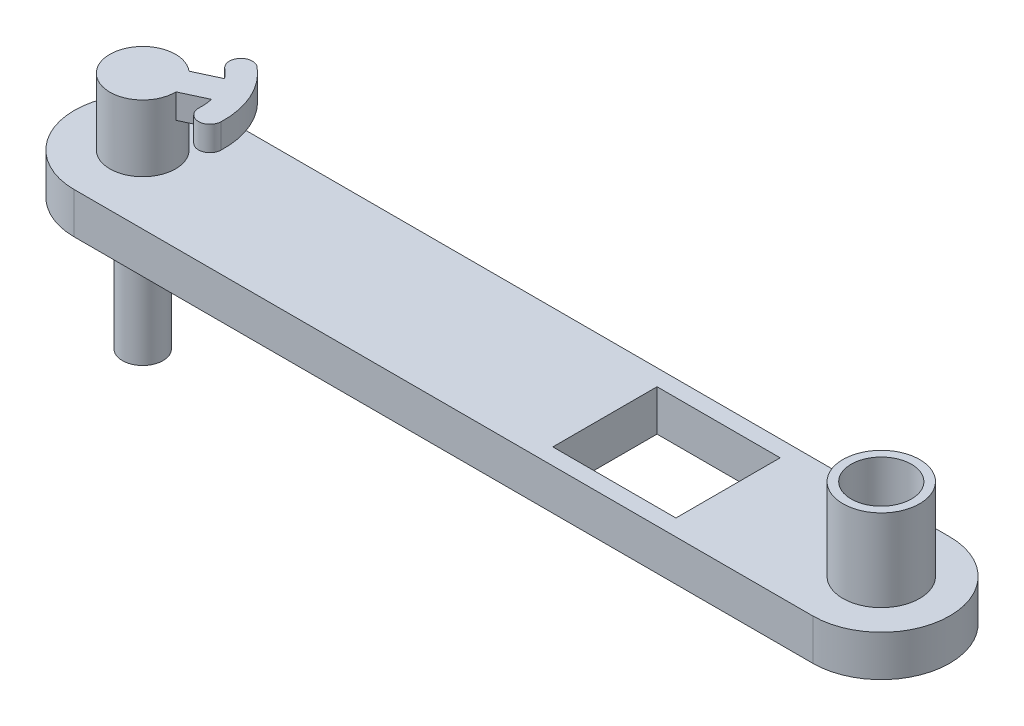
ISO-10303-21;
HEADER;
FILE_DESCRIPTION(('STEP AP214'),'2;1');
FILE_NAME('part.step','',(''),(''),'','','');
FILE_SCHEMA(('AUTOMOTIVE_DESIGN { 1 0 10303 214 1 1 1 1 }'));
ENDSEC;
DATA;
#1=APPLICATION_CONTEXT('core data for automotive mechanical design processes');
#2=APPLICATION_PROTOCOL_DEFINITION('international standard','automotive_design',2000,#1);
#3=PRODUCT_CONTEXT('',#1,'mechanical');
#4=PRODUCT('Part','Part','',(#3));
#5=PRODUCT_RELATED_PRODUCT_CATEGORY('part','',(#4));
#6=PRODUCT_DEFINITION_FORMATION('','',#4);
#7=PRODUCT_DEFINITION_CONTEXT('part definition',#1,'design');
#8=PRODUCT_DEFINITION('design','',#6,#7);
#9=PRODUCT_DEFINITION_SHAPE('','',#8);
#10=(LENGTH_UNIT() NAMED_UNIT(*) SI_UNIT(.MILLI.,.METRE.));
#11=(NAMED_UNIT(*) PLANE_ANGLE_UNIT() SI_UNIT($,.RADIAN.));
#12=(NAMED_UNIT(*) SI_UNIT($,.STERADIAN.) SOLID_ANGLE_UNIT());
#13=UNCERTAINTY_MEASURE_WITH_UNIT(LENGTH_MEASURE(1.E-05),#10,'distance_accuracy_value','');
#14=(GEOMETRIC_REPRESENTATION_CONTEXT(3) GLOBAL_UNCERTAINTY_ASSIGNED_CONTEXT((#13)) GLOBAL_UNIT_ASSIGNED_CONTEXT((#10,
#11,#12)) REPRESENTATION_CONTEXT('',''));
#15=CARTESIAN_POINT('',(0.,0.,0.));
#16=DIRECTION('',(0.,0.,1.));
#17=DIRECTION('',(1.,0.,0.));
#18=AXIS2_PLACEMENT_3D('',#15,#16,#17);
#19=CARTESIAN_POINT('',(0.,5.,0.));
#20=DIRECTION('',(0.,1.,0.));
#21=DIRECTION('',(0.,0.,1.));
#22=AXIS2_PLACEMENT_3D('',#19,#20,#21);
#23=PLANE('',#22);
#24=CARTESIAN_POINT('',(0.,5.,0.));
#25=DIRECTION('',(0.,1.,0.));
#26=DIRECTION('',(0.,0.,1.));
#27=AXIS2_PLACEMENT_3D('',#24,#25,#26);
#28=CIRCLE('',#27,8.35);
#29=CARTESIAN_POINT('',(0.,5.,-8.35));
#30=VERTEX_POINT('',#29);
#31=CARTESIAN_POINT('',(0.,5.,8.35));
#32=VERTEX_POINT('',#31);
#33=EDGE_CURVE('E280',#30,#32,#28,.T.);
#34=ORIENTED_EDGE('',*,*,#33,.T.);
#35=DIRECTION('',(1.,0.,0.));
#36=VECTOR('',#35,1.);
#37=CARTESIAN_POINT('',(0.,5.,8.35));
#38=LINE('',#37,#36);
#39=CARTESIAN_POINT('',(90.,5.,8.35));
#40=VERTEX_POINT('',#39);
#41=EDGE_CURVE('E283',#32,#40,#38,.T.);
#42=ORIENTED_EDGE('',*,*,#41,.T.);
#43=CARTESIAN_POINT('',(90.,5.,0.));
#44=DIRECTION('',(0.,1.,0.));
#45=DIRECTION('',(0.,0.,1.));
#46=AXIS2_PLACEMENT_3D('',#43,#44,#45);
#47=CIRCLE('',#46,8.35);
#48=CARTESIAN_POINT('',(90.,5.,-8.35));
#49=VERTEX_POINT('',#48);
#50=EDGE_CURVE('E287',#40,#49,#47,.T.);
#51=ORIENTED_EDGE('',*,*,#50,.T.);
#52=DIRECTION('',(-1.,0.,0.));
#53=VECTOR('',#52,1.);
#54=CARTESIAN_POINT('',(0.,5.,-8.35));
#55=LINE('',#54,#53);
#56=EDGE_CURVE('E289',#49,#30,#55,.T.);
#57=ORIENTED_EDGE('',*,*,#56,.T.);
#58=EDGE_LOOP('',(#34,#42,#51,#57));
#59=FACE_BOUND('',#58,.T.);
#60=CARTESIAN_POINT('',(0.,5.,0.));
#61=DIRECTION('',(0.,1.,0.));
#62=DIRECTION('',(0.,0.,1.));
#63=AXIS2_PLACEMENT_3D('',#60,#61,#62);
#64=CIRCLE('',#63,4.);
#65=CARTESIAN_POINT('',(0.,5.,4.));
#66=VERTEX_POINT('',#65);
#67=EDGE_CURVE('E270',#66,#66,#64,.T.);
#68=ORIENTED_EDGE('',*,*,#67,.F.);
#69=EDGE_LOOP('',(#68));
#70=FACE_BOUND('',#69,.T.);
#71=DIRECTION('',(0.,0.,-1.));
#72=VECTOR('',#71,1.);
#73=CARTESIAN_POINT('',(71.325,5.,0.));
#74=LINE('',#73,#72);
#75=CARTESIAN_POINT('',(71.325,5.,6.35));
#76=VERTEX_POINT('',#75);
#77=CARTESIAN_POINT('',(71.325,5.,-6.35));
#78=VERTEX_POINT('',#77);
#79=EDGE_CURVE('E171',#76,#78,#74,.T.);
#80=ORIENTED_EDGE('',*,*,#79,.F.);
#81=DIRECTION('',(1.,0.,0.));
#82=VECTOR('',#81,1.);
#83=CARTESIAN_POINT('',(0.,5.,6.34999999999999));
#84=LINE('',#83,#82);
#85=CARTESIAN_POINT('',(56.325,5.,6.35));
#86=VERTEX_POINT('',#85);
#87=EDGE_CURVE('E197',#86,#76,#84,.T.);
#88=ORIENTED_EDGE('',*,*,#87,.F.);
#89=DIRECTION('',(0.,0.,1.));
#90=VECTOR('',#89,1.);
#91=CARTESIAN_POINT('',(56.325,5.,0.));
#92=LINE('',#91,#90);
#93=CARTESIAN_POINT('',(56.325,5.,-6.35));
#94=VERTEX_POINT('',#93);
#95=EDGE_CURVE('E205',#94,#86,#92,.T.);
#96=ORIENTED_EDGE('',*,*,#95,.F.);
#97=DIRECTION('',(-1.,0.,0.));
#98=VECTOR('',#97,1.);
#99=CARTESIAN_POINT('',(0.,5.,-6.34999999999999));
#100=LINE('',#99,#98);
#101=EDGE_CURVE('E208',#78,#94,#100,.T.);
#102=ORIENTED_EDGE('',*,*,#101,.F.);
#103=EDGE_LOOP('',(#80,#88,#96,#102));
#104=FACE_BOUND('',#103,.T.);
#105=CARTESIAN_POINT('',(90.,5.,0.));
#106=DIRECTION('',(0.,1.,0.));
#107=DIRECTION('',(0.,0.,1.));
#108=AXIS2_PLACEMENT_3D('',#105,#106,#107);
#109=CIRCLE('',#108,4.675);
#110=CARTESIAN_POINT('',(90.,5.,4.675));
#111=VERTEX_POINT('',#110);
#112=EDGE_CURVE('E339',#111,#111,#109,.T.);
#113=ORIENTED_EDGE('',*,*,#112,.F.);
#114=EDGE_LOOP('',(#113));
#115=FACE_BOUND('',#114,.T.);
#116=ADVANCED_FACE('F47',(#59,#70,#104,#115),#23,.T.);
#117=CARTESIAN_POINT('',(0.,13.1,0.));
#118=DIRECTION('',(0.,-1.,0.));
#119=DIRECTION('',(0.,0.,-1.));
#120=AXIS2_PLACEMENT_3D('',#117,#118,#119);
#121=CYLINDRICAL_SURFACE('',#120,4.);
#122=ORIENTED_EDGE('',*,*,#67,.T.);
#123=EDGE_LOOP('',(#122));
#124=FACE_BOUND('',#123,.T.);
#125=DIRECTION('',(0.,-1.,0.));
#126=VECTOR('',#125,1.);
#127=CARTESIAN_POINT('',(2.60383776477137,13.1,-3.03645004812371));
#128=LINE('',#127,#126);
#129=CARTESIAN_POINT('',(2.60383776477137,13.1,-3.03645004812371));
#130=VERTEX_POINT('',#129);
#131=CARTESIAN_POINT('',(2.60383776477137,10.1,-3.03645004812371));
#132=VERTEX_POINT('',#131);
#133=EDGE_CURVE('E252',#130,#132,#128,.T.);
#134=ORIENTED_EDGE('',*,*,#133,.T.);
#135=CARTESIAN_POINT('',(0.,10.1,0.));
#136=DIRECTION('',(0.,-1.,0.));
#137=DIRECTION('',(0.,0.,1.));
#138=AXIS2_PLACEMENT_3D('',#135,#136,#137);
#139=CIRCLE('',#138,4.);
#140=CARTESIAN_POINT('',(3.99957991722122,10.1,-0.0579696969175384));
#141=VERTEX_POINT('',#140);
#142=EDGE_CURVE('E244',#132,#141,#139,.T.);
#143=ORIENTED_EDGE('',*,*,#142,.T.);
#144=DIRECTION('',(0.,-1.,0.));
#145=VECTOR('',#144,1.);
#146=CARTESIAN_POINT('',(3.99957991722122,13.1,-0.0579696969175384));
#147=LINE('',#146,#145);
#148=CARTESIAN_POINT('',(3.99957991722122,13.1,-0.0579696969175384));
#149=VERTEX_POINT('',#148);
#150=EDGE_CURVE('E250',#149,#141,#147,.T.);
#151=ORIENTED_EDGE('',*,*,#150,.F.);
#152=CARTESIAN_POINT('',(0.,13.1,0.));
#153=DIRECTION('',(0.,1.,0.));
#154=DIRECTION('',(0.,0.,1.));
#155=AXIS2_PLACEMENT_3D('',#152,#153,#154);
#156=CIRCLE('',#155,4.);
#157=EDGE_CURVE('E271',#130,#149,#156,.T.);
#158=ORIENTED_EDGE('',*,*,#157,.F.);
#159=EDGE_LOOP('',(#134,#143,#151,#158));
#160=FACE_BOUND('',#159,.T.);
#161=ADVANCED_FACE('F331',(#124,#160),#121,.T.);
#162=CARTESIAN_POINT('',(0.,5.,0.));
#163=DIRECTION('',(0.,-1.,0.));
#164=DIRECTION('',(0.,0.,-1.));
#165=AXIS2_PLACEMENT_3D('',#162,#163,#164);
#166=CYLINDRICAL_SURFACE('',#165,8.35);
#167=CARTESIAN_POINT('',(0.,0.,0.));
#168=DIRECTION('',(0.,1.,0.));
#169=DIRECTION('',(0.,0.,1.));
#170=AXIS2_PLACEMENT_3D('',#167,#168,#169);
#171=CIRCLE('',#170,8.35);
#172=CARTESIAN_POINT('',(0.,0.,-8.35));
#173=VERTEX_POINT('',#172);
#174=CARTESIAN_POINT('',(0.,0.,8.35));
#175=VERTEX_POINT('',#174);
#176=EDGE_CURVE('E279',#173,#175,#171,.T.);
#177=ORIENTED_EDGE('',*,*,#176,.T.);
#178=DIRECTION('',(0.,-1.,0.));
#179=VECTOR('',#178,1.);
#180=CARTESIAN_POINT('',(0.,5.,8.35));
#181=LINE('',#180,#179);
#182=EDGE_CURVE('E55',#32,#175,#181,.T.);
#183=ORIENTED_EDGE('',*,*,#182,.F.);
#184=ORIENTED_EDGE('',*,*,#33,.F.);
#185=DIRECTION('',(0.,-1.,0.));
#186=VECTOR('',#185,1.);
#187=CARTESIAN_POINT('',(0.,5.,-8.35));
#188=LINE('',#187,#186);
#189=EDGE_CURVE('E292',#30,#173,#188,.T.);
#190=ORIENTED_EDGE('',*,*,#189,.T.);
#191=EDGE_LOOP('',(#177,#183,#184,#190));
#192=FACE_BOUND('',#191,.T.);
#193=ADVANCED_FACE('F49',(#192),#166,.T.);
#194=CARTESIAN_POINT('',(0.,5.,8.35));
#195=DIRECTION('',(0.,0.,-1.));
#196=DIRECTION('',(-1.,0.,0.));
#197=AXIS2_PLACEMENT_3D('',#194,#195,#196);
#198=PLANE('',#197);
#199=DIRECTION('',(1.,0.,0.));
#200=VECTOR('',#199,1.);
#201=CARTESIAN_POINT('',(0.,0.,8.35));
#202=LINE('',#201,#200);
#203=CARTESIAN_POINT('',(90.,0.,8.35));
#204=VERTEX_POINT('',#203);
#205=EDGE_CURVE('E295',#175,#204,#202,.T.);
#206=ORIENTED_EDGE('',*,*,#205,.T.);
#207=DIRECTION('',(0.,-1.,0.));
#208=VECTOR('',#207,1.);
#209=CARTESIAN_POINT('',(90.,5.,8.35));
#210=LINE('',#209,#208);
#211=EDGE_CURVE('E307',#40,#204,#210,.T.);
#212=ORIENTED_EDGE('',*,*,#211,.F.);
#213=ORIENTED_EDGE('',*,*,#41,.F.);
#214=ORIENTED_EDGE('',*,*,#182,.T.);
#215=EDGE_LOOP('',(#206,#212,#213,#214));
#216=FACE_BOUND('',#215,.T.);
#217=ADVANCED_FACE('F312',(#216),#198,.F.);
#218=CARTESIAN_POINT('',(90.,5.,0.));
#219=DIRECTION('',(0.,-1.,0.));
#220=DIRECTION('',(0.,0.,-1.));
#221=AXIS2_PLACEMENT_3D('',#218,#219,#220);
#222=CYLINDRICAL_SURFACE('',#221,8.35);
#223=CARTESIAN_POINT('',(90.,0.,0.));
#224=DIRECTION('',(0.,1.,0.));
#225=DIRECTION('',(0.,0.,1.));
#226=AXIS2_PLACEMENT_3D('',#223,#224,#225);
#227=CIRCLE('',#226,8.35);
#228=CARTESIAN_POINT('',(90.,0.,-8.35));
#229=VERTEX_POINT('',#228);
#230=EDGE_CURVE('E298',#204,#229,#227,.T.);
#231=ORIENTED_EDGE('',*,*,#230,.T.);
#232=DIRECTION('',(0.,-1.,0.));
#233=VECTOR('',#232,1.);
#234=CARTESIAN_POINT('',(90.,5.,-8.35));
#235=LINE('',#234,#233);
#236=EDGE_CURVE('E304',#49,#229,#235,.T.);
#237=ORIENTED_EDGE('',*,*,#236,.F.);
#238=ORIENTED_EDGE('',*,*,#50,.F.);
#239=ORIENTED_EDGE('',*,*,#211,.T.);
#240=EDGE_LOOP('',(#231,#237,#238,#239));
#241=FACE_BOUND('',#240,.T.);
#242=ADVANCED_FACE('F323',(#241),#222,.T.);
#243=CARTESIAN_POINT('',(0.,5.,-8.35));
#244=DIRECTION('',(0.,0.,1.));
#245=DIRECTION('',(1.,0.,0.));
#246=AXIS2_PLACEMENT_3D('',#243,#244,#245);
#247=PLANE('',#246);
#248=DIRECTION('',(-1.,0.,0.));
#249=VECTOR('',#248,1.);
#250=CARTESIAN_POINT('',(0.,0.,-8.35));
#251=LINE('',#250,#249);
#252=EDGE_CURVE('E284',#229,#173,#251,.T.);
#253=ORIENTED_EDGE('',*,*,#252,.T.);
#254=ORIENTED_EDGE('',*,*,#189,.F.);
#255=ORIENTED_EDGE('',*,*,#56,.F.);
#256=ORIENTED_EDGE('',*,*,#236,.T.);
#257=EDGE_LOOP('',(#253,#254,#255,#256));
#258=FACE_BOUND('',#257,.T.);
#259=ADVANCED_FACE('F327',(#258),#247,.F.);
#260=CARTESIAN_POINT('',(0.,0.,0.));
#261=DIRECTION('',(0.,1.,0.));
#262=DIRECTION('',(0.,0.,1.));
#263=AXIS2_PLACEMENT_3D('',#260,#261,#262);
#264=PLANE('',#263);
#265=CARTESIAN_POINT('',(90.,0.,0.));
#266=DIRECTION('',(0.,-1.,0.));
#267=DIRECTION('',(0.,0.,-1.));
#268=AXIS2_PLACEMENT_3D('',#265,#266,#267);
#269=CIRCLE('',#268,3.675);
#270=CARTESIAN_POINT('',(90.,0.,-3.675));
#271=VERTEX_POINT('',#270);
#272=EDGE_CURVE('E194',#271,#271,#269,.T.);
#273=ORIENTED_EDGE('',*,*,#272,.F.);
#274=EDGE_LOOP('',(#273));
#275=FACE_BOUND('',#274,.T.);
#276=DIRECTION('',(-1.,0.,0.));
#277=VECTOR('',#276,1.);
#278=CARTESIAN_POINT('',(71.325,0.,6.35));
#279=LINE('',#278,#277);
#280=CARTESIAN_POINT('',(71.325,0.,6.35));
#281=VERTEX_POINT('',#280);
#282=CARTESIAN_POINT('',(56.325,0.,6.35));
#283=VERTEX_POINT('',#282);
#284=EDGE_CURVE('E192',#281,#283,#279,.T.);
#285=ORIENTED_EDGE('',*,*,#284,.F.);
#286=DIRECTION('',(0.,0.,1.));
#287=VECTOR('',#286,1.);
#288=CARTESIAN_POINT('',(71.325,0.,6.35));
#289=LINE('',#288,#287);
#290=CARTESIAN_POINT('',(71.325,0.,-6.35));
#291=VERTEX_POINT('',#290);
#292=EDGE_CURVE('E74',#291,#281,#289,.T.);
#293=ORIENTED_EDGE('',*,*,#292,.F.);
#294=DIRECTION('',(1.,0.,0.));
#295=VECTOR('',#294,1.);
#296=CARTESIAN_POINT('',(71.325,0.,-6.35));
#297=LINE('',#296,#295);
#298=CARTESIAN_POINT('',(56.325,0.,-6.35));
#299=VERTEX_POINT('',#298);
#300=EDGE_CURVE('E179',#299,#291,#297,.T.);
#301=ORIENTED_EDGE('',*,*,#300,.F.);
#302=DIRECTION('',(0.,0.,-1.));
#303=VECTOR('',#302,1.);
#304=CARTESIAN_POINT('',(56.325,0.,6.35));
#305=LINE('',#304,#303);
#306=EDGE_CURVE('E186',#283,#299,#305,.T.);
#307=ORIENTED_EDGE('',*,*,#306,.F.);
#308=EDGE_LOOP('',(#285,#293,#301,#307));
#309=FACE_BOUND('',#308,.T.);
#310=CARTESIAN_POINT('',(0.,0.,0.));
#311=DIRECTION('',(0.,1.,0.));
#312=DIRECTION('',(0.,0.,1.));
#313=AXIS2_PLACEMENT_3D('',#310,#311,#312);
#314=CIRCLE('',#313,2.475);
#315=CARTESIAN_POINT('',(0.,0.,2.475));
#316=VERTEX_POINT('',#315);
#317=EDGE_CURVE('E11',#316,#316,#314,.F.);
#318=ORIENTED_EDGE('',*,*,#317,.F.);
#319=EDGE_LOOP('',(#318));
#320=FACE_BOUND('',#319,.T.);
#321=ORIENTED_EDGE('',*,*,#176,.F.);
#322=ORIENTED_EDGE('',*,*,#252,.F.);
#323=ORIENTED_EDGE('',*,*,#230,.F.);
#324=ORIENTED_EDGE('',*,*,#205,.F.);
#325=EDGE_LOOP('',(#321,#322,#323,#324));
#326=FACE_BOUND('',#325,.T.);
#327=ADVANCED_FACE('F190',(#275,#309,#320,#326),#264,.F.);
#328=CARTESIAN_POINT('',(0.,-16.,0.));
#329=DIRECTION('',(0.,1.,0.));
#330=DIRECTION('',(0.,0.,1.));
#331=AXIS2_PLACEMENT_3D('',#328,#329,#330);
#332=CYLINDRICAL_SURFACE('',#331,2.475);
#333=CARTESIAN_POINT('',(0.,-16.,0.));
#334=DIRECTION('',(0.,-1.,0.));
#335=DIRECTION('',(0.,0.,-1.));
#336=AXIS2_PLACEMENT_3D('',#333,#334,#335);
#337=CIRCLE('',#336,2.475);
#338=CARTESIAN_POINT('',(0.,-16.,-2.475));
#339=VERTEX_POINT('',#338);
#340=EDGE_CURVE('E274',#339,#339,#337,.T.);
#341=ORIENTED_EDGE('',*,*,#340,.F.);
#342=EDGE_LOOP('',(#341));
#343=FACE_BOUND('',#342,.T.);
#344=ORIENTED_EDGE('',*,*,#317,.T.);
#345=EDGE_LOOP('',(#344));
#346=FACE_BOUND('',#345,.T.);
#347=ADVANCED_FACE('F415',(#343,#346),#332,.T.);
#348=CARTESIAN_POINT('',(0.,-16.,0.));
#349=DIRECTION('',(0.,-1.,0.));
#350=DIRECTION('',(0.,0.,-1.));
#351=AXIS2_PLACEMENT_3D('',#348,#349,#350);
#352=PLANE('',#351);
#353=ORIENTED_EDGE('',*,*,#340,.T.);
#354=EDGE_LOOP('',(#353));
#355=FACE_BOUND('',#354,.T.);
#356=ADVANCED_FACE('F408',(#355),#352,.T.);
#357=CARTESIAN_POINT('',(0.,13.1,0.));
#358=DIRECTION('',(0.,1.,0.));
#359=DIRECTION('',(0.,0.,1.));
#360=AXIS2_PLACEMENT_3D('',#357,#358,#359);
#361=PLANE('',#360);
#362=ORIENTED_EDGE('',*,*,#157,.T.);
#363=DIRECTION('',(0.90630778703665,0.,-0.4226182617407));
#364=VECTOR('',#363,1.);
#365=CARTESIAN_POINT('',(3.99957991722122,13.1,-0.0579696969175384));
#366=LINE('',#365,#364);
#367=CARTESIAN_POINT('',(6.95339829885507,13.1,-1.43535782907241));
#368=VERTEX_POINT('',#367);
#369=EDGE_CURVE('E229',#149,#368,#366,.T.);
#370=ORIENTED_EDGE('',*,*,#369,.T.);
#371=CARTESIAN_POINT('',(0.,13.1,0.));
#372=DIRECTION('',(0.,-1.,0.));
#373=DIRECTION('',(0.,0.,1.));
#374=AXIS2_PLACEMENT_3D('',#371,#372,#373);
#375=CIRCLE('',#374,7.1);
#376=CARTESIAN_POINT('',(7.0956020711865,13.1,0.249862456911571));
#377=VERTEX_POINT('',#376);
#378=EDGE_CURVE('E214',#368,#377,#375,.T.);
#379=ORIENTED_EDGE('',*,*,#378,.T.);
#380=CARTESIAN_POINT('',(8.49473487395566,13.1,0.299131110387092));
#381=DIRECTION('',(0.,1.,0.));
#382=DIRECTION('',(0.,0.,1.));
#383=AXIS2_PLACEMENT_3D('',#380,#381,#382);
#384=CIRCLE('',#383,1.4);
#385=CARTESIAN_POINT('',(9.89386767672483,13.1,0.348399763862611));
#386=VERTEX_POINT('',#385);
#387=EDGE_CURVE('E217',#377,#386,#384,.T.);
#388=ORIENTED_EDGE('',*,*,#387,.T.);
#389=CARTESIAN_POINT('',(0.,13.1,0.));
#390=DIRECTION('',(0.,1.,0.));
#391=DIRECTION('',(0.,0.,1.));
#392=AXIS2_PLACEMENT_3D('',#389,#390,#391);
#393=CIRCLE('',#392,9.9);
#394=CARTESIAN_POINT('',(6.29540856547502,13.1,-7.64053865861196));
#395=VERTEX_POINT('',#394);
#396=EDGE_CURVE('E220',#386,#395,#393,.T.);
#397=ORIENTED_EDGE('',*,*,#396,.T.);
#398=CARTESIAN_POINT('',(5.40514876833714,13.1,-6.56005844426279));
#399=DIRECTION('',(0.,1.,0.));
#400=DIRECTION('',(0.,0.,1.));
#401=AXIS2_PLACEMENT_3D('',#398,#399,#400);
#402=CIRCLE('',#401,1.4);
#403=CARTESIAN_POINT('',(4.51488897119926,13.1,-5.47957822991363));
#404=VERTEX_POINT('',#403);
#405=EDGE_CURVE('E222',#395,#404,#402,.T.);
#406=ORIENTED_EDGE('',*,*,#405,.T.);
#407=CARTESIAN_POINT('',(0.,13.1,0.));
#408=DIRECTION('',(0.,-1.,0.));
#409=DIRECTION('',(0.,0.,1.));
#410=AXIS2_PLACEMENT_3D('',#407,#408,#409);
#411=CIRCLE('',#410,7.1);
#412=CARTESIAN_POINT('',(5.56031389370999,13.1,-4.41507750820024));
#413=VERTEX_POINT('',#412);
#414=EDGE_CURVE('E224',#404,#413,#411,.T.);
#415=ORIENTED_EDGE('',*,*,#414,.T.);
#416=DIRECTION('',(-0.90630778703665,0.,0.4226182617407));
#417=VECTOR('',#416,1.);
#418=CARTESIAN_POINT('',(2.60383776477137,13.1,-3.03645004812371));
#419=LINE('',#418,#417);
#420=EDGE_CURVE('E226',#413,#130,#419,.T.);
#421=ORIENTED_EDGE('',*,*,#420,.T.);
#422=EDGE_LOOP('',(#362,#370,#379,#388,#397,#406,#415,#421));
#423=FACE_BOUND('',#422,.T.);
#424=ADVANCED_FACE('F404',(#423),#361,.T.);
#425=CARTESIAN_POINT('',(0.,13.1,0.));
#426=DIRECTION('',(0.,-1.,0.));
#427=DIRECTION('',(0.,0.,-1.));
#428=AXIS2_PLACEMENT_3D('',#425,#426,#427);
#429=CYLINDRICAL_SURFACE('',#428,7.1);
#430=CARTESIAN_POINT('',(0.,10.1,0.));
#431=DIRECTION('',(0.,-1.,0.));
#432=DIRECTION('',(0.,0.,1.));
#433=AXIS2_PLACEMENT_3D('',#430,#431,#432);
#434=CIRCLE('',#433,7.1);
#435=CARTESIAN_POINT('',(6.95339829885507,10.1,-1.43535782907241));
#436=VERTEX_POINT('',#435);
#437=CARTESIAN_POINT('',(7.0956020711865,10.1,0.249862456911571));
#438=VERTEX_POINT('',#437);
#439=EDGE_CURVE('E213',#436,#438,#434,.T.);
#440=ORIENTED_EDGE('',*,*,#439,.T.);
#441=DIRECTION('',(0.,-1.,0.));
#442=VECTOR('',#441,1.);
#443=CARTESIAN_POINT('',(7.0956020711865,13.1,0.249862456911571));
#444=LINE('',#443,#442);
#445=EDGE_CURVE('E267',#377,#438,#444,.T.);
#446=ORIENTED_EDGE('',*,*,#445,.F.);
#447=ORIENTED_EDGE('',*,*,#378,.F.);
#448=DIRECTION('',(0.,-1.,0.));
#449=VECTOR('',#448,1.);
#450=CARTESIAN_POINT('',(6.95339829885507,13.1,-1.43535782907241));
#451=LINE('',#450,#449);
#452=EDGE_CURVE('E231',#368,#436,#451,.T.);
#453=ORIENTED_EDGE('',*,*,#452,.T.);
#454=EDGE_LOOP('',(#440,#446,#447,#453));
#455=FACE_BOUND('',#454,.T.);
#456=ADVANCED_FACE('F400',(#455),#429,.F.);
#457=CARTESIAN_POINT('',(8.49473487395566,13.1,0.299131110387092));
#458=DIRECTION('',(0.,-1.,0.));
#459=DIRECTION('',(0.,0.,-1.));
#460=AXIS2_PLACEMENT_3D('',#457,#458,#459);
#461=CYLINDRICAL_SURFACE('',#460,1.4);
#462=CARTESIAN_POINT('',(8.49473487395566,10.1,0.299131110387092));
#463=DIRECTION('',(0.,1.,0.));
#464=DIRECTION('',(0.,0.,1.));
#465=AXIS2_PLACEMENT_3D('',#462,#463,#464);
#466=CIRCLE('',#465,1.4);
#467=CARTESIAN_POINT('',(9.89386767672483,10.1,0.348399763862611));
#468=VERTEX_POINT('',#467);
#469=EDGE_CURVE('E234',#438,#468,#466,.T.);
#470=ORIENTED_EDGE('',*,*,#469,.T.);
#471=DIRECTION('',(0.,-1.,0.));
#472=VECTOR('',#471,1.);
#473=CARTESIAN_POINT('',(9.89386767672483,13.1,0.348399763862611));
#474=LINE('',#473,#472);
#475=EDGE_CURVE('E264',#386,#468,#474,.T.);
#476=ORIENTED_EDGE('',*,*,#475,.F.);
#477=ORIENTED_EDGE('',*,*,#387,.F.);
#478=ORIENTED_EDGE('',*,*,#445,.T.);
#479=EDGE_LOOP('',(#470,#476,#477,#478));
#480=FACE_BOUND('',#479,.T.);
#481=ADVANCED_FACE('F396',(#480),#461,.T.);
#482=CARTESIAN_POINT('',(0.,13.1,0.));
#483=DIRECTION('',(0.,-1.,0.));
#484=DIRECTION('',(0.,0.,-1.));
#485=AXIS2_PLACEMENT_3D('',#482,#483,#484);
#486=CYLINDRICAL_SURFACE('',#485,9.9);
#487=CARTESIAN_POINT('',(0.,10.1,0.));
#488=DIRECTION('',(0.,1.,0.));
#489=DIRECTION('',(0.,0.,1.));
#490=AXIS2_PLACEMENT_3D('',#487,#488,#489);
#491=CIRCLE('',#490,9.9);
#492=CARTESIAN_POINT('',(6.29540856547502,10.1,-7.64053865861196));
#493=VERTEX_POINT('',#492);
#494=EDGE_CURVE('E236',#468,#493,#491,.T.);
#495=ORIENTED_EDGE('',*,*,#494,.T.);
#496=DIRECTION('',(0.,-1.,0.));
#497=VECTOR('',#496,1.);
#498=CARTESIAN_POINT('',(6.29540856547502,13.1,-7.64053865861196));
#499=LINE('',#498,#497);
#500=EDGE_CURVE('E261',#395,#493,#499,.T.);
#501=ORIENTED_EDGE('',*,*,#500,.F.);
#502=ORIENTED_EDGE('',*,*,#396,.F.);
#503=ORIENTED_EDGE('',*,*,#475,.T.);
#504=EDGE_LOOP('',(#495,#501,#502,#503));
#505=FACE_BOUND('',#504,.T.);
#506=ADVANCED_FACE('F392',(#505),#486,.T.);
#507=CARTESIAN_POINT('',(5.40514876833714,13.1,-6.56005844426279));
#508=DIRECTION('',(0.,-1.,0.));
#509=DIRECTION('',(0.,0.,-1.));
#510=AXIS2_PLACEMENT_3D('',#507,#508,#509);
#511=CYLINDRICAL_SURFACE('',#510,1.4);
#512=CARTESIAN_POINT('',(5.40514876833714,10.1,-6.56005844426279));
#513=DIRECTION('',(0.,1.,0.));
#514=DIRECTION('',(0.,0.,1.));
#515=AXIS2_PLACEMENT_3D('',#512,#513,#514);
#516=CIRCLE('',#515,1.4);
#517=CARTESIAN_POINT('',(4.51488897119926,10.1,-5.47957822991363));
#518=VERTEX_POINT('',#517);
#519=EDGE_CURVE('E238',#493,#518,#516,.T.);
#520=ORIENTED_EDGE('',*,*,#519,.T.);
#521=DIRECTION('',(0.,-1.,0.));
#522=VECTOR('',#521,1.);
#523=CARTESIAN_POINT('',(4.51488897119926,13.1,-5.47957822991363));
#524=LINE('',#523,#522);
#525=EDGE_CURVE('E258',#404,#518,#524,.T.);
#526=ORIENTED_EDGE('',*,*,#525,.F.);
#527=ORIENTED_EDGE('',*,*,#405,.F.);
#528=ORIENTED_EDGE('',*,*,#500,.T.);
#529=EDGE_LOOP('',(#520,#526,#527,#528));
#530=FACE_BOUND('',#529,.T.);
#531=ADVANCED_FACE('F388',(#530),#511,.T.);
#532=CARTESIAN_POINT('',(0.,13.1,0.));
#533=DIRECTION('',(0.,-1.,0.));
#534=DIRECTION('',(0.,0.,-1.));
#535=AXIS2_PLACEMENT_3D('',#532,#533,#534);
#536=CYLINDRICAL_SURFACE('',#535,7.1);
#537=CARTESIAN_POINT('',(0.,10.1,0.));
#538=DIRECTION('',(0.,-1.,0.));
#539=DIRECTION('',(0.,0.,1.));
#540=AXIS2_PLACEMENT_3D('',#537,#538,#539);
#541=CIRCLE('',#540,7.1);
#542=CARTESIAN_POINT('',(5.56031389370999,10.1,-4.41507750820024));
#543=VERTEX_POINT('',#542);
#544=EDGE_CURVE('E240',#518,#543,#541,.T.);
#545=ORIENTED_EDGE('',*,*,#544,.T.);
#546=DIRECTION('',(0.,-1.,0.));
#547=VECTOR('',#546,1.);
#548=CARTESIAN_POINT('',(5.56031389370999,13.1,-4.41507750820024));
#549=LINE('',#548,#547);
#550=EDGE_CURVE('E255',#413,#543,#549,.T.);
#551=ORIENTED_EDGE('',*,*,#550,.F.);
#552=ORIENTED_EDGE('',*,*,#414,.F.);
#553=ORIENTED_EDGE('',*,*,#525,.T.);
#554=EDGE_LOOP('',(#545,#551,#552,#553));
#555=FACE_BOUND('',#554,.T.);
#556=ADVANCED_FACE('F384',(#555),#536,.F.);
#557=CARTESIAN_POINT('',(2.60383776477137,13.1,-3.03645004812371));
#558=DIRECTION('',(0.4226182617407,0.,0.906307787036649));
#559=DIRECTION('',(0.90630778703665,0.,-0.4226182617407));
#560=AXIS2_PLACEMENT_3D('',#557,#558,#559);
#561=PLANE('',#560);
#562=DIRECTION('',(-0.90630778703665,0.,0.4226182617407));
#563=VECTOR('',#562,1.);
#564=CARTESIAN_POINT('',(2.60383776477137,10.1,-3.03645004812371));
#565=LINE('',#564,#563);
#566=EDGE_CURVE('E242',#543,#132,#565,.T.);
#567=ORIENTED_EDGE('',*,*,#566,.T.);
#568=ORIENTED_EDGE('',*,*,#133,.F.);
#569=ORIENTED_EDGE('',*,*,#420,.F.);
#570=ORIENTED_EDGE('',*,*,#550,.T.);
#571=EDGE_LOOP('',(#567,#568,#569,#570));
#572=FACE_BOUND('',#571,.T.);
#573=ADVANCED_FACE('F380',(#572),#561,.F.);
#574=CARTESIAN_POINT('',(3.99957991722122,13.1,-0.0579696969175384));
#575=DIRECTION('',(-0.4226182617407,0.,-0.90630778703665));
#576=DIRECTION('',(-0.90630778703665,0.,0.4226182617407));
#577=AXIS2_PLACEMENT_3D('',#574,#575,#576);
#578=PLANE('',#577);
#579=DIRECTION('',(0.90630778703665,0.,-0.4226182617407));
#580=VECTOR('',#579,1.);
#581=CARTESIAN_POINT('',(3.99957991722122,10.1,-0.0579696969175384));
#582=LINE('',#581,#580);
#583=EDGE_CURVE('E218',#141,#436,#582,.T.);
#584=ORIENTED_EDGE('',*,*,#583,.T.);
#585=ORIENTED_EDGE('',*,*,#452,.F.);
#586=ORIENTED_EDGE('',*,*,#369,.F.);
#587=ORIENTED_EDGE('',*,*,#150,.T.);
#588=EDGE_LOOP('',(#584,#585,#586,#587));
#589=FACE_BOUND('',#588,.T.);
#590=ADVANCED_FACE('F376',(#589),#578,.F.);
#591=CARTESIAN_POINT('',(0.,10.1,0.));
#592=DIRECTION('',(0.,1.,0.));
#593=DIRECTION('',(0.,0.,1.));
#594=AXIS2_PLACEMENT_3D('',#591,#592,#593);
#595=PLANE('',#594);
#596=ORIENTED_EDGE('',*,*,#439,.F.);
#597=ORIENTED_EDGE('',*,*,#583,.F.);
#598=ORIENTED_EDGE('',*,*,#142,.F.);
#599=ORIENTED_EDGE('',*,*,#566,.F.);
#600=ORIENTED_EDGE('',*,*,#544,.F.);
#601=ORIENTED_EDGE('',*,*,#519,.F.);
#602=ORIENTED_EDGE('',*,*,#494,.F.);
#603=ORIENTED_EDGE('',*,*,#469,.F.);
#604=EDGE_LOOP('',(#596,#597,#598,#599,#600,#601,#602,#603));
#605=FACE_BOUND('',#604,.T.);
#606=ADVANCED_FACE('F373',(#605),#595,.F.);
#607=CARTESIAN_POINT('',(71.325,13.1,6.35));
#608=DIRECTION('',(1.,0.,0.));
#609=DIRECTION('',(0.,0.,-1.));
#610=AXIS2_PLACEMENT_3D('',#607,#608,#609);
#611=PLANE('',#610);
#612=ORIENTED_EDGE('',*,*,#79,.T.);
#613=DIRECTION('',(0.,-1.,0.));
#614=VECTOR('',#613,1.);
#615=CARTESIAN_POINT('',(71.325,13.1,-6.35));
#616=LINE('',#615,#614);
#617=EDGE_CURVE('E167',#78,#291,#616,.T.);
#618=ORIENTED_EDGE('',*,*,#617,.T.);
#619=ORIENTED_EDGE('',*,*,#292,.T.);
#620=DIRECTION('',(0.,-1.,0.));
#621=VECTOR('',#620,1.);
#622=CARTESIAN_POINT('',(71.325,13.1,6.35));
#623=LINE('',#622,#621);
#624=EDGE_CURVE('E187',#76,#281,#623,.T.);
#625=ORIENTED_EDGE('',*,*,#624,.F.);
#626=EDGE_LOOP('',(#612,#618,#619,#625));
#627=FACE_BOUND('',#626,.T.);
#628=ADVANCED_FACE('F169',(#627),#611,.F.);
#629=CARTESIAN_POINT('',(71.325,13.1,-6.35));
#630=DIRECTION('',(0.,0.,-1.));
#631=DIRECTION('',(-1.,0.,0.));
#632=AXIS2_PLACEMENT_3D('',#629,#630,#631);
#633=PLANE('',#632);
#634=ORIENTED_EDGE('',*,*,#101,.T.);
#635=DIRECTION('',(0.,-1.,0.));
#636=VECTOR('',#635,1.);
#637=CARTESIAN_POINT('',(56.325,13.1,-6.35));
#638=LINE('',#637,#636);
#639=EDGE_CURVE('E175',#94,#299,#638,.T.);
#640=ORIENTED_EDGE('',*,*,#639,.T.);
#641=ORIENTED_EDGE('',*,*,#300,.T.);
#642=ORIENTED_EDGE('',*,*,#617,.F.);
#643=EDGE_LOOP('',(#634,#640,#641,#642));
#644=FACE_BOUND('',#643,.T.);
#645=ADVANCED_FACE('F180',(#644),#633,.F.);
#646=CARTESIAN_POINT('',(56.325,13.1,6.35));
#647=DIRECTION('',(-1.,0.,0.));
#648=DIRECTION('',(0.,0.,1.));
#649=AXIS2_PLACEMENT_3D('',#646,#647,#648);
#650=PLANE('',#649);
#651=ORIENTED_EDGE('',*,*,#95,.T.);
#652=DIRECTION('',(0.,-1.,0.));
#653=VECTOR('',#652,1.);
#654=CARTESIAN_POINT('',(56.325,13.1,6.35));
#655=LINE('',#654,#653);
#656=EDGE_CURVE('E65',#86,#283,#655,.T.);
#657=ORIENTED_EDGE('',*,*,#656,.T.);
#658=ORIENTED_EDGE('',*,*,#306,.T.);
#659=ORIENTED_EDGE('',*,*,#639,.F.);
#660=EDGE_LOOP('',(#651,#657,#658,#659));
#661=FACE_BOUND('',#660,.T.);
#662=ADVANCED_FACE('F355',(#661),#650,.F.);
#663=CARTESIAN_POINT('',(71.325,13.1,6.35));
#664=DIRECTION('',(0.,0.,1.));
#665=DIRECTION('',(1.,0.,0.));
#666=AXIS2_PLACEMENT_3D('',#663,#664,#665);
#667=PLANE('',#666);
#668=ORIENTED_EDGE('',*,*,#87,.T.);
#669=ORIENTED_EDGE('',*,*,#624,.T.);
#670=ORIENTED_EDGE('',*,*,#284,.T.);
#671=ORIENTED_EDGE('',*,*,#656,.F.);
#672=EDGE_LOOP('',(#668,#669,#670,#671));
#673=FACE_BOUND('',#672,.T.);
#674=ADVANCED_FACE('F357',(#673),#667,.F.);
#675=CARTESIAN_POINT('',(90.,13.1,0.));
#676=DIRECTION('',(0.,-1.,0.));
#677=DIRECTION('',(0.,0.,-1.));
#678=AXIS2_PLACEMENT_3D('',#675,#676,#677);
#679=CYLINDRICAL_SURFACE('',#678,3.675);
#680=CARTESIAN_POINT('',(90.,15.,0.));
#681=DIRECTION('',(0.,1.,0.));
#682=DIRECTION('',(0.,0.,1.));
#683=AXIS2_PLACEMENT_3D('',#680,#681,#682);
#684=CIRCLE('',#683,3.675);
#685=CARTESIAN_POINT('',(90.,15.,-3.675));
#686=VERTEX_POINT('',#685);
#687=EDGE_CURVE('E341',#686,#686,#684,.T.);
#688=CARTESIAN_POINT('',(90.,0.,-3.675));
#689=CARTESIAN_POINT('',(90.,0.156250000000002,-3.675));
#690=CARTESIAN_POINT('',(90.,0.312500000000002,-3.675));
#691=CARTESIAN_POINT('',(90.,0.625000000000002,-3.675));
#692=CARTESIAN_POINT('',(90.,0.781250000000002,-3.675));
#693=CARTESIAN_POINT('',(90.,1.09375,-3.675));
#694=CARTESIAN_POINT('',(90.,1.25,-3.675));
#695=CARTESIAN_POINT('',(90.,1.5625,-3.675));
#696=CARTESIAN_POINT('',(90.,1.71875,-3.675));
#697=CARTESIAN_POINT('',(90.,2.03125,-3.675));
#698=CARTESIAN_POINT('',(90.,2.1875,-3.675));
#699=CARTESIAN_POINT('',(90.,2.5,-3.675));
#700=CARTESIAN_POINT('',(90.,2.65625,-3.675));
#701=CARTESIAN_POINT('',(90.,2.96875,-3.675));
#702=CARTESIAN_POINT('',(90.,3.125,-3.675));
#703=CARTESIAN_POINT('',(90.,3.4375,-3.675));
#704=CARTESIAN_POINT('',(90.,3.59375,-3.675));
#705=CARTESIAN_POINT('',(90.,3.90625,-3.675));
#706=CARTESIAN_POINT('',(90.,4.0625,-3.675));
#707=CARTESIAN_POINT('',(90.,4.375,-3.675));
#708=CARTESIAN_POINT('',(90.,4.53125,-3.675));
#709=CARTESIAN_POINT('',(90.,4.84375,-3.675));
#710=CARTESIAN_POINT('',(90.,5.,-3.675));
#711=CARTESIAN_POINT('',(90.,5.3125,-3.675));
#712=CARTESIAN_POINT('',(90.,5.46875,-3.675));
#713=CARTESIAN_POINT('',(90.,5.78125,-3.675));
#714=CARTESIAN_POINT('',(90.,5.9375,-3.675));
#715=CARTESIAN_POINT('',(90.,6.25,-3.675));
#716=CARTESIAN_POINT('',(90.,6.40625,-3.675));
#717=CARTESIAN_POINT('',(90.,6.71875,-3.675));
#718=CARTESIAN_POINT('',(90.,6.875,-3.675));
#719=CARTESIAN_POINT('',(90.,7.1875,-3.675));
#720=CARTESIAN_POINT('',(90.,7.34375,-3.675));
#721=CARTESIAN_POINT('',(90.,7.65625,-3.675));
#722=CARTESIAN_POINT('',(90.,7.8125,-3.675));
#723=CARTESIAN_POINT('',(90.,8.125,-3.675));
#724=CARTESIAN_POINT('',(90.,8.28125,-3.675));
#725=CARTESIAN_POINT('',(90.,8.59375,-3.675));
#726=CARTESIAN_POINT('',(90.,8.75,-3.675));
#727=CARTESIAN_POINT('',(90.,9.0625,-3.675));
#728=CARTESIAN_POINT('',(90.,9.21875,-3.675));
#729=CARTESIAN_POINT('',(90.,9.53125,-3.675));
#730=CARTESIAN_POINT('',(90.,9.6875,-3.675));
#731=CARTESIAN_POINT('',(90.,10.,-3.675));
#732=CARTESIAN_POINT('',(90.,10.15625,-3.675));
#733=CARTESIAN_POINT('',(90.,10.46875,-3.675));
#734=CARTESIAN_POINT('',(90.,10.625,-3.675));
#735=CARTESIAN_POINT('',(90.,10.9375,-3.675));
#736=CARTESIAN_POINT('',(90.,11.09375,-3.675));
#737=CARTESIAN_POINT('',(90.,11.40625,-3.675));
#738=CARTESIAN_POINT('',(90.,11.5625,-3.675));
#739=CARTESIAN_POINT('',(90.,11.875,-3.675));
#740=CARTESIAN_POINT('',(90.,12.03125,-3.675));
#741=CARTESIAN_POINT('',(90.,12.34375,-3.675));
#742=CARTESIAN_POINT('',(90.,12.5,-3.675));
#743=CARTESIAN_POINT('',(90.,12.8125,-3.675));
#744=CARTESIAN_POINT('',(90.,12.96875,-3.675));
#745=CARTESIAN_POINT('',(90.,13.28125,-3.675));
#746=CARTESIAN_POINT('',(90.,13.4375,-3.675));
#747=CARTESIAN_POINT('',(90.,13.75,-3.675));
#748=CARTESIAN_POINT('',(90.,13.90625,-3.675));
#749=CARTESIAN_POINT('',(90.,14.21875,-3.675));
#750=CARTESIAN_POINT('',(90.,14.375,-3.675));
#751=CARTESIAN_POINT('',(90.,14.6875,-3.675));
#752=CARTESIAN_POINT('',(90.,14.84375,-3.675));
#753=CARTESIAN_POINT('',(90.,15.,-3.675));
#754=B_SPLINE_CURVE_WITH_KNOTS('',3,(#688,#689,#690,#691,#692,#693,#694,#695,#696,#697,#698,
#699,#700,#701,#702,#703,#704,#705,#706,#707,#708,#709,#710,#711,#712,#713,#714,#715,#716,#717,
#718,#719,#720,#721,#722,#723,#724,#725,#726,#727,#728,#729,#730,#731,#732,#733,#734,#735,#736,
#737,#738,#739,#740,#741,#742,#743,#744,#745,#746,#747,#748,#749,#750,#751,#752,#753),
.UNSPECIFIED.,.F.,.F.,(4,2,2,2,2,2,2,2,2,2,2,2,2,2,2,2,2,2,2,2,2,2,2,2,2,2,2,2,2,2,2,2,4),(0.,
0.46875,0.937500000000001,1.40625,1.875,2.34375,2.8125,3.28125,3.75,4.21875,4.6875,5.15625,
5.625,6.09375,6.5625,7.03125,7.5,7.96875,8.4375,8.90625,9.375,9.84375,10.3125,10.78125,11.25,
11.71875,12.1875,12.65625,13.125,13.59375,14.0625,14.53125,15.),.UNSPECIFIED.);
#755=EDGE_CURVE('BSEAM359',#271,#686,#754,.T.);
#756=ORIENTED_EDGE('',*,*,#272,.T.);
#757=ORIENTED_EDGE('',*,*,#687,.T.);
#758=ORIENTED_EDGE('',*,*,#755,.T.);
#759=ORIENTED_EDGE('',*,*,#755,.F.);
#760=EDGE_LOOP('',(#756,#758,#757,#759));
#761=FACE_BOUND('',#760,.T.);
#762=ADVANCED_FACE('F359',(#761),#679,.F.);
#763=CARTESIAN_POINT('',(90.,15.,0.));
#764=DIRECTION('',(0.,1.,0.));
#765=DIRECTION('',(0.,0.,1.));
#766=AXIS2_PLACEMENT_3D('',#763,#764,#765);
#767=PLANE('',#766);
#768=CARTESIAN_POINT('',(90.,15.,0.));
#769=DIRECTION('',(0.,1.,0.));
#770=DIRECTION('',(0.,0.,1.));
#771=AXIS2_PLACEMENT_3D('',#768,#769,#770);
#772=CIRCLE('',#771,4.675);
#773=CARTESIAN_POINT('',(90.,15.,4.675));
#774=VERTEX_POINT('',#773);
#775=EDGE_CURVE('E176',#774,#774,#772,.T.);
#776=ORIENTED_EDGE('',*,*,#775,.T.);
#777=EDGE_LOOP('',(#776));
#778=FACE_BOUND('',#777,.T.);
#779=ORIENTED_EDGE('',*,*,#687,.F.);
#780=EDGE_LOOP('',(#779));
#781=FACE_BOUND('',#780,.T.);
#782=ADVANCED_FACE('F364',(#778,#781),#767,.T.);
#783=CARTESIAN_POINT('',(90.,15.,0.));
#784=DIRECTION('',(0.,-1.,0.));
#785=DIRECTION('',(0.,0.,-1.));
#786=AXIS2_PLACEMENT_3D('',#783,#784,#785);
#787=CYLINDRICAL_SURFACE('',#786,4.675);
#788=ORIENTED_EDGE('',*,*,#775,.F.);
#789=EDGE_LOOP('',(#788));
#790=FACE_BOUND('',#789,.T.);
#791=ORIENTED_EDGE('',*,*,#112,.T.);
#792=EDGE_LOOP('',(#791));
#793=FACE_BOUND('',#792,.T.);
#794=ADVANCED_FACE('F550',(#790,#793),#787,.T.);
#795=CLOSED_SHELL('',(#116,#161,#193,#217,#242,#259,#327,#347,#356,#424,#456,#481,#506,#531,
#556,#573,#590,#606,#628,#645,#662,#674,#762,#782,#794));
#796=MANIFOLD_SOLID_BREP('B2',#795);
#797=ADVANCED_BREP_SHAPE_REPRESENTATION('',(#18,#796),#14);
#798=SHAPE_DEFINITION_REPRESENTATION(#9,#797);
ENDSEC;
END-ISO-10303-21;
